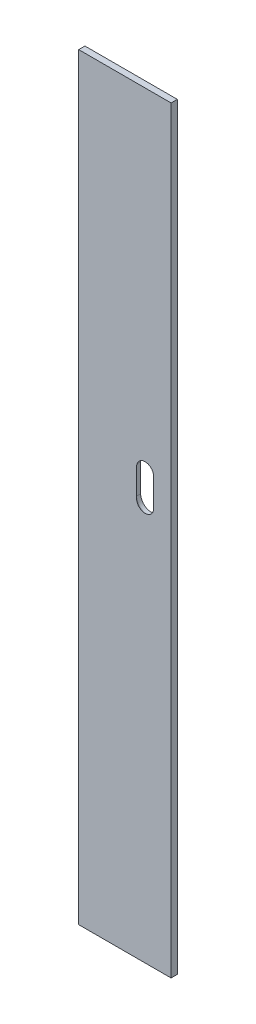
ISO-10303-21;
HEADER;
FILE_DESCRIPTION(('STEP AP214'),'2;1');
FILE_NAME('part.step','',(''),(''),'','','');
FILE_SCHEMA(('AUTOMOTIVE_DESIGN { 1 0 10303 214 1 1 1 1 }'));
ENDSEC;
DATA;
#1=APPLICATION_CONTEXT('core data for automotive mechanical design processes');
#2=APPLICATION_PROTOCOL_DEFINITION('international standard','automotive_design',2000,#1);
#3=PRODUCT_CONTEXT('',#1,'mechanical');
#4=PRODUCT('Part','Part','',(#3));
#5=PRODUCT_RELATED_PRODUCT_CATEGORY('part','',(#4));
#6=PRODUCT_DEFINITION_FORMATION('','',#4);
#7=PRODUCT_DEFINITION_CONTEXT('part definition',#1,'design');
#8=PRODUCT_DEFINITION('design','',#6,#7);
#9=PRODUCT_DEFINITION_SHAPE('','',#8);
#10=(LENGTH_UNIT() NAMED_UNIT(*) SI_UNIT(.MILLI.,.METRE.));
#11=(NAMED_UNIT(*) PLANE_ANGLE_UNIT() SI_UNIT($,.RADIAN.));
#12=(NAMED_UNIT(*) SI_UNIT($,.STERADIAN.) SOLID_ANGLE_UNIT());
#13=UNCERTAINTY_MEASURE_WITH_UNIT(LENGTH_MEASURE(1.E-05),#10,'distance_accuracy_value','');
#14=(GEOMETRIC_REPRESENTATION_CONTEXT(3) GLOBAL_UNCERTAINTY_ASSIGNED_CONTEXT((#13)) GLOBAL_UNIT_ASSIGNED_CONTEXT((#10,
#11,#12)) REPRESENTATION_CONTEXT('',''));
#15=CARTESIAN_POINT('',(0.,0.,0.));
#16=DIRECTION('',(0.,0.,1.));
#17=DIRECTION('',(1.,0.,0.));
#18=AXIS2_PLACEMENT_3D('',#15,#16,#17);
#19=CARTESIAN_POINT('',(0.,0.,0.));
#20=DIRECTION('',(0.,0.,1.));
#21=DIRECTION('',(1.,0.,0.));
#22=AXIS2_PLACEMENT_3D('',#19,#20,#21);
#23=PLANE('',#22);
#24=DIRECTION('',(0.,1.,0.));
#25=VECTOR('',#24,1.);
#26=CARTESIAN_POINT('',(36.9999999999996,-17.900000000062,0.));
#27=LINE('',#26,#25);
#28=CARTESIAN_POINT('',(36.9999999999996,-17.900000000062,0.));
#29=VERTEX_POINT('',#28);
#30=CARTESIAN_POINT('',(36.9999999999996,2172.09999999994,0.));
#31=VERTEX_POINT('',#30);
#32=EDGE_CURVE('E167',#29,#31,#27,.T.);
#33=ORIENTED_EDGE('',*,*,#32,.F.);
#34=DIRECTION('',(1.,0.,0.));
#35=VECTOR('',#34,1.);
#36=CARTESIAN_POINT('',(36.9999999999996,-17.900000000062,0.));
#37=LINE('',#36,#35);
#38=CARTESIAN_POINT('',(-230.,-17.9000000000619,0.));
#39=VERTEX_POINT('',#38);
#40=EDGE_CURVE('E177',#39,#29,#37,.T.);
#41=ORIENTED_EDGE('',*,*,#40,.F.);
#42=DIRECTION('',(0.,-1.,0.));
#43=VECTOR('',#42,1.);
#44=CARTESIAN_POINT('',(-230.,-17.9000000000619,0.));
#45=LINE('',#44,#43);
#46=CARTESIAN_POINT('',(-230.,2172.09999999994,0.));
#47=VERTEX_POINT('',#46);
#48=EDGE_CURVE('E188',#47,#39,#45,.T.);
#49=ORIENTED_EDGE('',*,*,#48,.F.);
#50=DIRECTION('',(-1.,0.,0.));
#51=VECTOR('',#50,1.);
#52=CARTESIAN_POINT('',(36.9999999999996,2172.09999999994,0.));
#53=LINE('',#52,#51);
#54=EDGE_CURVE('E186',#31,#47,#53,.T.);
#55=ORIENTED_EDGE('',*,*,#54,.F.);
#56=EDGE_LOOP('',(#33,#41,#49,#55));
#57=FACE_BOUND('',#56,.T.);
#58=CARTESIAN_POINT('',(-38.0000000000004,1212.09999999994,0.));
#59=DIRECTION('',(0.,0.,-1.));
#60=DIRECTION('',(-1.,0.,0.));
#61=AXIS2_PLACEMENT_3D('',#58,#59,#60);
#62=CIRCLE('',#61,30.9);
#63=CARTESIAN_POINT('',(-68.9000000000004,1212.09999999994,0.));
#64=VERTEX_POINT('',#63);
#65=CARTESIAN_POINT('',(-7.10000000000033,1212.09999999994,0.));
#66=VERTEX_POINT('',#65);
#67=EDGE_CURVE('E127',#64,#66,#62,.T.);
#68=ORIENTED_EDGE('',*,*,#67,.F.);
#69=DIRECTION('',(0.,1.,0.));
#70=VECTOR('',#69,1.);
#71=CARTESIAN_POINT('',(-68.9000000000008,1132.09999999994,0.));
#72=LINE('',#71,#70);
#73=CARTESIAN_POINT('',(-68.9000000000008,1132.09999999994,0.));
#74=VERTEX_POINT('',#73);
#75=EDGE_CURVE('E115',#74,#64,#72,.T.);
#76=ORIENTED_EDGE('',*,*,#75,.F.);
#77=CARTESIAN_POINT('',(-38.0000000000004,1132.09999999994,0.));
#78=DIRECTION('',(0.,0.,-1.));
#79=DIRECTION('',(1.,0.,0.));
#80=AXIS2_PLACEMENT_3D('',#77,#78,#79);
#81=CIRCLE('',#80,30.9);
#82=CARTESIAN_POINT('',(-7.10000000000035,1132.09999999994,0.));
#83=VERTEX_POINT('',#82);
#84=EDGE_CURVE('E142',#83,#74,#81,.T.);
#85=ORIENTED_EDGE('',*,*,#84,.F.);
#86=DIRECTION('',(0.,-1.,0.));
#87=VECTOR('',#86,1.);
#88=CARTESIAN_POINT('',(-7.10000000000033,1212.09999999994,0.));
#89=LINE('',#88,#87);
#90=EDGE_CURVE('E132',#66,#83,#89,.T.);
#91=ORIENTED_EDGE('',*,*,#90,.F.);
#92=EDGE_LOOP('',(#68,#76,#85,#91));
#93=FACE_BOUND('',#92,.T.);
#94=ADVANCED_FACE('F36',(#57,#93),#23,.F.);
#95=CARTESIAN_POINT('',(36.9999999999996,-17.900000000062,18.));
#96=DIRECTION('',(-1.,0.,0.));
#97=DIRECTION('',(0.,0.,1.));
#98=AXIS2_PLACEMENT_3D('',#95,#96,#97);
#99=PLANE('',#98);
#100=ORIENTED_EDGE('',*,*,#32,.T.);
#101=DIRECTION('',(0.,0.,-1.));
#102=VECTOR('',#101,1.);
#103=CARTESIAN_POINT('',(36.9999999999996,2172.09999999994,18.));
#104=LINE('',#103,#102);
#105=CARTESIAN_POINT('',(36.9999999999996,2172.09999999994,18.));
#106=VERTEX_POINT('',#105);
#107=EDGE_CURVE('E11',#106,#31,#104,.T.);
#108=ORIENTED_EDGE('',*,*,#107,.F.);
#109=DIRECTION('',(0.,1.,0.));
#110=VECTOR('',#109,1.);
#111=CARTESIAN_POINT('',(36.9999999999996,-17.900000000062,18.));
#112=LINE('',#111,#110);
#113=CARTESIAN_POINT('',(36.9999999999996,-17.900000000062,18.));
#114=VERTEX_POINT('',#113);
#115=EDGE_CURVE('E173',#114,#106,#112,.T.);
#116=ORIENTED_EDGE('',*,*,#115,.F.);
#117=DIRECTION('',(0.,0.,-1.));
#118=VECTOR('',#117,1.);
#119=CARTESIAN_POINT('',(36.9999999999996,-17.900000000062,18.));
#120=LINE('',#119,#118);
#121=EDGE_CURVE('E183',#114,#29,#120,.T.);
#122=ORIENTED_EDGE('',*,*,#121,.T.);
#123=EDGE_LOOP('',(#100,#108,#116,#122));
#124=FACE_BOUND('',#123,.T.);
#125=ADVANCED_FACE('F38',(#124),#99,.F.);
#126=CARTESIAN_POINT('',(36.9999999999996,2172.09999999994,18.));
#127=DIRECTION('',(0.,-1.,0.));
#128=DIRECTION('',(0.,0.,-1.));
#129=AXIS2_PLACEMENT_3D('',#126,#127,#128);
#130=PLANE('',#129);
#131=ORIENTED_EDGE('',*,*,#54,.T.);
#132=DIRECTION('',(0.,0.,-1.));
#133=VECTOR('',#132,1.);
#134=CARTESIAN_POINT('',(-230.,2172.09999999994,18.));
#135=LINE('',#134,#133);
#136=CARTESIAN_POINT('',(-230.,2172.09999999994,18.));
#137=VERTEX_POINT('',#136);
#138=EDGE_CURVE('E44',#137,#47,#135,.T.);
#139=ORIENTED_EDGE('',*,*,#138,.F.);
#140=DIRECTION('',(-1.,0.,0.));
#141=VECTOR('',#140,1.);
#142=CARTESIAN_POINT('',(36.9999999999996,2172.09999999994,18.));
#143=LINE('',#142,#141);
#144=EDGE_CURVE('E176',#106,#137,#143,.T.);
#145=ORIENTED_EDGE('',*,*,#144,.F.);
#146=ORIENTED_EDGE('',*,*,#107,.T.);
#147=EDGE_LOOP('',(#131,#139,#145,#146));
#148=FACE_BOUND('',#147,.T.);
#149=ADVANCED_FACE('F215',(#148),#130,.F.);
#150=CARTESIAN_POINT('',(-230.,-17.9000000000619,18.));
#151=DIRECTION('',(1.,0.,0.));
#152=DIRECTION('',(0.,0.,-1.));
#153=AXIS2_PLACEMENT_3D('',#150,#151,#152);
#154=PLANE('',#153);
#155=ORIENTED_EDGE('',*,*,#48,.T.);
#156=DIRECTION('',(0.,0.,-1.));
#157=VECTOR('',#156,1.);
#158=CARTESIAN_POINT('',(-230.,-17.9000000000619,18.));
#159=LINE('',#158,#157);
#160=CARTESIAN_POINT('',(-230.,-17.9000000000619,18.));
#161=VERTEX_POINT('',#160);
#162=EDGE_CURVE('E193',#161,#39,#159,.T.);
#163=ORIENTED_EDGE('',*,*,#162,.F.);
#164=DIRECTION('',(0.,-1.,0.));
#165=VECTOR('',#164,1.);
#166=CARTESIAN_POINT('',(-230.,-17.9000000000619,18.));
#167=LINE('',#166,#165);
#168=EDGE_CURVE('E179',#137,#161,#167,.T.);
#169=ORIENTED_EDGE('',*,*,#168,.F.);
#170=ORIENTED_EDGE('',*,*,#138,.T.);
#171=EDGE_LOOP('',(#155,#163,#169,#170));
#172=FACE_BOUND('',#171,.T.);
#173=ADVANCED_FACE('F200',(#172),#154,.F.);
#174=CARTESIAN_POINT('',(36.9999999999996,-17.900000000062,18.));
#175=DIRECTION('',(0.,1.,0.));
#176=DIRECTION('',(-1.,0.,0.));
#177=AXIS2_PLACEMENT_3D('',#174,#175,#176);
#178=PLANE('',#177);
#179=ORIENTED_EDGE('',*,*,#40,.T.);
#180=ORIENTED_EDGE('',*,*,#121,.F.);
#181=DIRECTION('',(1.,0.,0.));
#182=VECTOR('',#181,1.);
#183=CARTESIAN_POINT('',(36.9999999999996,-17.900000000062,18.));
#184=LINE('',#183,#182);
#185=EDGE_CURVE('E181',#161,#114,#184,.T.);
#186=ORIENTED_EDGE('',*,*,#185,.F.);
#187=ORIENTED_EDGE('',*,*,#162,.T.);
#188=EDGE_LOOP('',(#179,#180,#186,#187));
#189=FACE_BOUND('',#188,.T.);
#190=ADVANCED_FACE('F208',(#189),#178,.F.);
#191=CARTESIAN_POINT('',(0.,0.,18.));
#192=DIRECTION('',(0.,0.,1.));
#193=DIRECTION('',(1.,0.,0.));
#194=AXIS2_PLACEMENT_3D('',#191,#192,#193);
#195=PLANE('',#194);
#196=CARTESIAN_POINT('',(-38.0000000000004,1212.09999999994,18.));
#197=DIRECTION('',(0.,0.,-1.));
#198=DIRECTION('',(-1.,0.,0.));
#199=AXIS2_PLACEMENT_3D('',#196,#197,#198);
#200=CIRCLE('',#199,24.6);
#201=CARTESIAN_POINT('',(-62.6000000000008,1212.09999999994,18.));
#202=VERTEX_POINT('',#201);
#203=CARTESIAN_POINT('',(-13.4000000000003,1212.09999999994,18.));
#204=VERTEX_POINT('',#203);
#205=EDGE_CURVE('E133',#202,#204,#200,.T.);
#206=ORIENTED_EDGE('',*,*,#205,.T.);
#207=DIRECTION('',(0.,-1.,0.));
#208=VECTOR('',#207,1.);
#209=CARTESIAN_POINT('',(-13.4000000000003,1212.09999999994,18.));
#210=LINE('',#209,#208);
#211=CARTESIAN_POINT('',(-13.4000000000004,1132.09999999994,18.));
#212=VERTEX_POINT('',#211);
#213=EDGE_CURVE('E140',#204,#212,#210,.T.);
#214=ORIENTED_EDGE('',*,*,#213,.T.);
#215=CARTESIAN_POINT('',(-38.0000000000004,1132.09999999994,18.));
#216=DIRECTION('',(0.,0.,-1.));
#217=DIRECTION('',(1.,0.,0.));
#218=AXIS2_PLACEMENT_3D('',#215,#216,#217);
#219=CIRCLE('',#218,24.6);
#220=CARTESIAN_POINT('',(-62.6000000000004,1132.09999999994,18.));
#221=VERTEX_POINT('',#220);
#222=EDGE_CURVE('E143',#212,#221,#219,.T.);
#223=ORIENTED_EDGE('',*,*,#222,.T.);
#224=DIRECTION('',(0.,1.,0.));
#225=VECTOR('',#224,1.);
#226=CARTESIAN_POINT('',(-62.6000000000008,1132.09999999994,18.));
#227=LINE('',#226,#225);
#228=EDGE_CURVE('E122',#221,#202,#227,.T.);
#229=ORIENTED_EDGE('',*,*,#228,.T.);
#230=EDGE_LOOP('',(#206,#214,#223,#229));
#231=FACE_BOUND('',#230,.T.);
#232=ORIENTED_EDGE('',*,*,#115,.T.);
#233=ORIENTED_EDGE('',*,*,#144,.T.);
#234=ORIENTED_EDGE('',*,*,#168,.T.);
#235=ORIENTED_EDGE('',*,*,#185,.T.);
#236=EDGE_LOOP('',(#232,#233,#234,#235));
#237=FACE_BOUND('',#236,.T.);
#238=ADVANCED_FACE('F214',(#231,#237),#195,.T.);
#239=CARTESIAN_POINT('',(-38.0000000000004,1212.09999999994,11.7));
#240=DIRECTION('',(0.,0.,-1.));
#241=DIRECTION('',(-1.,0.,0.));
#242=AXIS2_PLACEMENT_3D('',#239,#240,#241);
#243=TOROIDAL_SURFACE('',#242,24.6,6.3);
#244=CARTESIAN_POINT('',(-38.0000000000004,1212.09999999994,11.7));
#245=DIRECTION('',(0.,0.,-1.));
#246=DIRECTION('',(-1.,0.,0.));
#247=AXIS2_PLACEMENT_3D('',#244,#245,#246);
#248=CIRCLE('',#247,30.9);
#249=CARTESIAN_POINT('',(-68.9000000000004,1212.09999999994,11.7));
#250=VERTEX_POINT('',#249);
#251=CARTESIAN_POINT('',(-7.10000000000033,1212.09999999994,11.7));
#252=VERTEX_POINT('',#251);
#253=EDGE_CURVE('E129',#250,#252,#248,.T.);
#254=ORIENTED_EDGE('',*,*,#253,.T.);
#255=CARTESIAN_POINT('',(-13.4000000000003,1212.09999999994,11.7));
#256=DIRECTION('',(0.,1.,0.));
#257=DIRECTION('',(-1.,0.,0.));
#258=AXIS2_PLACEMENT_3D('',#255,#256,#257);
#259=CIRCLE('',#258,6.3);
#260=EDGE_CURVE('E136',#204,#252,#259,.T.);
#261=ORIENTED_EDGE('',*,*,#260,.F.);
#262=ORIENTED_EDGE('',*,*,#205,.F.);
#263=CARTESIAN_POINT('',(-62.6000000000004,1212.09999999994,11.7));
#264=DIRECTION('',(0.,-1.,0.));
#265=DIRECTION('',(1.,0.,0.));
#266=AXIS2_PLACEMENT_3D('',#263,#264,#265);
#267=CIRCLE('',#266,6.3);
#268=EDGE_CURVE('E51',#202,#250,#267,.T.);
#269=ORIENTED_EDGE('',*,*,#268,.T.);
#270=EDGE_LOOP('',(#254,#261,#262,#269));
#271=FACE_BOUND('',#270,.T.);
#272=ADVANCED_FACE('F233',(#271),#243,.F.);
#273=CARTESIAN_POINT('',(-38.0000000000004,1212.09999999994,18.));
#274=DIRECTION('',(0.,0.,-1.));
#275=DIRECTION('',(-1.,0.,0.));
#276=AXIS2_PLACEMENT_3D('',#273,#274,#275);
#277=CYLINDRICAL_SURFACE('',#276,30.9);
#278=DIRECTION('',(0.,0.,-1.));
#279=VECTOR('',#278,1.);
#280=CARTESIAN_POINT('',(-7.10000000000033,1212.09999999994,11.7));
#281=LINE('',#280,#279);
#282=EDGE_CURVE('E141',#252,#66,#281,.T.);
#283=ORIENTED_EDGE('',*,*,#282,.F.);
#284=ORIENTED_EDGE('',*,*,#253,.F.);
#285=DIRECTION('',(0.,0.,-1.));
#286=VECTOR('',#285,1.);
#287=CARTESIAN_POINT('',(-68.9000000000004,1212.09999999994,11.7));
#288=LINE('',#287,#286);
#289=EDGE_CURVE('E118',#250,#64,#288,.T.);
#290=ORIENTED_EDGE('',*,*,#289,.T.);
#291=ORIENTED_EDGE('',*,*,#67,.T.);
#292=EDGE_LOOP('',(#283,#284,#290,#291));
#293=FACE_BOUND('',#292,.T.);
#294=ADVANCED_FACE('F126',(#293),#277,.F.);
#295=CARTESIAN_POINT('',(-13.4000000000003,1212.09999999994,11.7));
#296=DIRECTION('',(0.,-1.,0.));
#297=DIRECTION('',(1.,0.,0.));
#298=AXIS2_PLACEMENT_3D('',#295,#296,#297);
#299=CYLINDRICAL_SURFACE('',#298,6.3);
#300=DIRECTION('',(0.,-1.,0.));
#301=VECTOR('',#300,1.);
#302=CARTESIAN_POINT('',(-7.10000000000033,1212.09999999994,11.7));
#303=LINE('',#302,#301);
#304=CARTESIAN_POINT('',(-7.10000000000035,1132.09999999994,11.7));
#305=VERTEX_POINT('',#304);
#306=EDGE_CURVE('E161',#252,#305,#303,.T.);
#307=ORIENTED_EDGE('',*,*,#306,.T.);
#308=CARTESIAN_POINT('',(-13.4000000000004,1132.09999999994,11.7));
#309=DIRECTION('',(0.,1.,0.));
#310=DIRECTION('',(-1.,0.,0.));
#311=AXIS2_PLACEMENT_3D('',#308,#309,#310);
#312=CIRCLE('',#311,6.3);
#313=EDGE_CURVE('E148',#212,#305,#312,.T.);
#314=ORIENTED_EDGE('',*,*,#313,.F.);
#315=ORIENTED_EDGE('',*,*,#213,.F.);
#316=ORIENTED_EDGE('',*,*,#260,.T.);
#317=EDGE_LOOP('',(#307,#314,#315,#316));
#318=FACE_BOUND('',#317,.T.);
#319=ADVANCED_FACE('F243',(#318),#299,.F.);
#320=CARTESIAN_POINT('',(-7.10000000000033,1212.09999999994,11.7));
#321=DIRECTION('',(-1.,0.,0.));
#322=DIRECTION('',(0.,-1.,0.));
#323=AXIS2_PLACEMENT_3D('',#320,#321,#322);
#324=PLANE('',#323);
#325=DIRECTION('',(0.,0.,-1.));
#326=VECTOR('',#325,1.);
#327=CARTESIAN_POINT('',(-7.10000000000036,1132.09999999994,11.7));
#328=LINE('',#327,#326);
#329=EDGE_CURVE('E144',#305,#83,#328,.T.);
#330=ORIENTED_EDGE('',*,*,#329,.F.);
#331=ORIENTED_EDGE('',*,*,#306,.F.);
#332=ORIENTED_EDGE('',*,*,#282,.T.);
#333=ORIENTED_EDGE('',*,*,#90,.T.);
#334=EDGE_LOOP('',(#330,#331,#332,#333));
#335=FACE_BOUND('',#334,.T.);
#336=ADVANCED_FACE('F247',(#335),#324,.T.);
#337=CARTESIAN_POINT('',(-38.0000000000004,1132.09999999994,11.7));
#338=DIRECTION('',(0.,0.,-1.));
#339=DIRECTION('',(-1.,0.,0.));
#340=AXIS2_PLACEMENT_3D('',#337,#338,#339);
#341=TOROIDAL_SURFACE('',#340,24.6,6.3);
#342=CARTESIAN_POINT('',(-38.0000000000004,1132.09999999994,11.7));
#343=DIRECTION('',(0.,0.,-1.));
#344=DIRECTION('',(1.,0.,0.));
#345=AXIS2_PLACEMENT_3D('',#342,#343,#344);
#346=CIRCLE('',#345,30.9);
#347=CARTESIAN_POINT('',(-68.9000000000004,1132.09999999994,11.7));
#348=VERTEX_POINT('',#347);
#349=EDGE_CURVE('E165',#305,#348,#346,.T.);
#350=ORIENTED_EDGE('',*,*,#349,.T.);
#351=CARTESIAN_POINT('',(-62.6000000000004,1132.09999999994,11.7));
#352=DIRECTION('',(0.,-1.,0.));
#353=DIRECTION('',(1.,0.,0.));
#354=AXIS2_PLACEMENT_3D('',#351,#352,#353);
#355=CIRCLE('',#354,6.3);
#356=EDGE_CURVE('E151',#221,#348,#355,.T.);
#357=ORIENTED_EDGE('',*,*,#356,.F.);
#358=ORIENTED_EDGE('',*,*,#222,.F.);
#359=ORIENTED_EDGE('',*,*,#313,.T.);
#360=EDGE_LOOP('',(#350,#357,#358,#359));
#361=FACE_BOUND('',#360,.T.);
#362=ADVANCED_FACE('F252',(#361),#341,.F.);
#363=CARTESIAN_POINT('',(-38.0000000000004,1132.09999999994,18.));
#364=DIRECTION('',(0.,0.,-1.));
#365=DIRECTION('',(-1.,0.,0.));
#366=AXIS2_PLACEMENT_3D('',#363,#364,#365);
#367=CYLINDRICAL_SURFACE('',#366,30.9);
#368=DIRECTION('',(0.,0.,-1.));
#369=VECTOR('',#368,1.);
#370=CARTESIAN_POINT('',(-68.9000000000004,1132.09999999994,11.7));
#371=LINE('',#370,#369);
#372=EDGE_CURVE('E59',#348,#74,#371,.T.);
#373=ORIENTED_EDGE('',*,*,#372,.F.);
#374=ORIENTED_EDGE('',*,*,#349,.F.);
#375=ORIENTED_EDGE('',*,*,#329,.T.);
#376=ORIENTED_EDGE('',*,*,#84,.T.);
#377=EDGE_LOOP('',(#373,#374,#375,#376));
#378=FACE_BOUND('',#377,.T.);
#379=ADVANCED_FACE('F250',(#378),#367,.F.);
#380=CARTESIAN_POINT('',(-62.6000000000008,1132.09999999994,11.7));
#381=DIRECTION('',(0.,1.,0.));
#382=DIRECTION('',(-1.,0.,0.));
#383=AXIS2_PLACEMENT_3D('',#380,#381,#382);
#384=CYLINDRICAL_SURFACE('',#383,6.3);
#385=ORIENTED_EDGE('',*,*,#228,.F.);
#386=ORIENTED_EDGE('',*,*,#356,.T.);
#387=DIRECTION('',(0.,1.,0.));
#388=VECTOR('',#387,1.);
#389=CARTESIAN_POINT('',(-68.9000000000008,1132.09999999994,11.7));
#390=LINE('',#389,#388);
#391=EDGE_CURVE('E154',#348,#250,#390,.T.);
#392=ORIENTED_EDGE('',*,*,#391,.T.);
#393=ORIENTED_EDGE('',*,*,#268,.F.);
#394=EDGE_LOOP('',(#385,#386,#392,#393));
#395=FACE_BOUND('',#394,.T.);
#396=ADVANCED_FACE('F253',(#395),#384,.F.);
#397=CARTESIAN_POINT('',(-68.9000000000008,1132.09999999994,11.7));
#398=DIRECTION('',(1.,0.,0.));
#399=DIRECTION('',(0.,1.,0.));
#400=AXIS2_PLACEMENT_3D('',#397,#398,#399);
#401=PLANE('',#400);
#402=ORIENTED_EDGE('',*,*,#391,.F.);
#403=ORIENTED_EDGE('',*,*,#372,.T.);
#404=ORIENTED_EDGE('',*,*,#75,.T.);
#405=ORIENTED_EDGE('',*,*,#289,.F.);
#406=EDGE_LOOP('',(#402,#403,#404,#405));
#407=FACE_BOUND('',#406,.T.);
#408=ADVANCED_FACE('F117',(#407),#401,.T.);
#409=CLOSED_SHELL('',(#94,#125,#149,#173,#190,#238,#272,#294,#319,#336,#362,#379,#396,#408));
#410=MANIFOLD_SOLID_BREP('B2',#409);
#411=ADVANCED_BREP_SHAPE_REPRESENTATION('',(#18,#410),#14);
#412=SHAPE_DEFINITION_REPRESENTATION(#9,#411);
ENDSEC;
END-ISO-10303-21;
